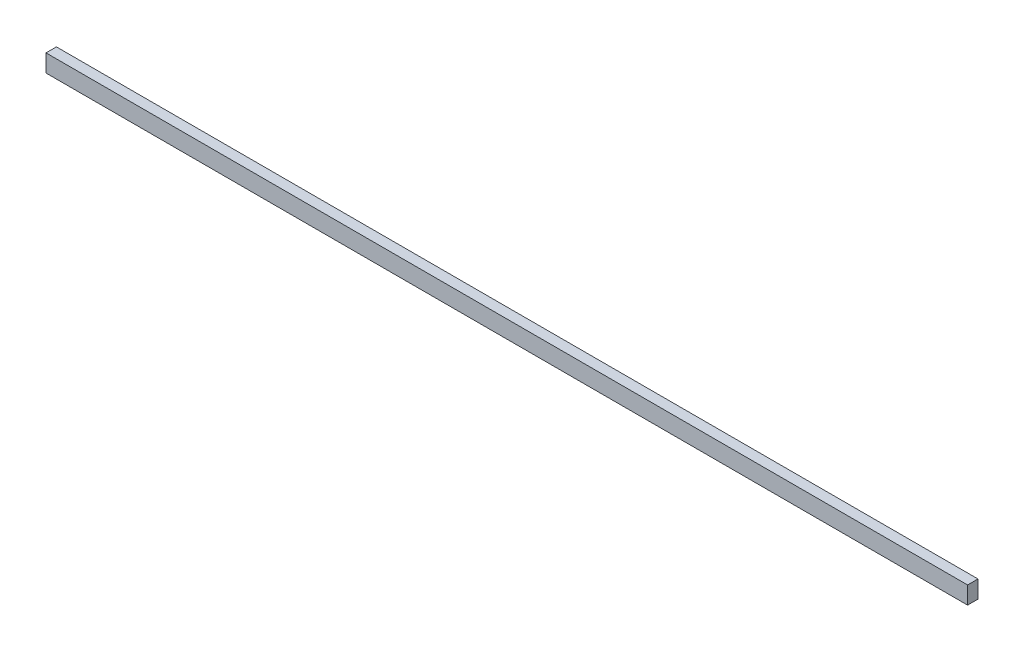
ISO-10303-21;
HEADER;
FILE_DESCRIPTION(('STEP AP214'),'2;1');
FILE_NAME('part.step','',(''),(''),'','','');
FILE_SCHEMA(('AUTOMOTIVE_DESIGN { 1 0 10303 214 1 1 1 1 }'));
ENDSEC;
DATA;
#1=APPLICATION_CONTEXT('core data for automotive mechanical design processes');
#2=APPLICATION_PROTOCOL_DEFINITION('international standard','automotive_design',2000,#1);
#3=PRODUCT_CONTEXT('',#1,'mechanical');
#4=PRODUCT('Part','Part','',(#3));
#5=PRODUCT_RELATED_PRODUCT_CATEGORY('part','',(#4));
#6=PRODUCT_DEFINITION_FORMATION('','',#4);
#7=PRODUCT_DEFINITION_CONTEXT('part definition',#1,'design');
#8=PRODUCT_DEFINITION('design','',#6,#7);
#9=PRODUCT_DEFINITION_SHAPE('','',#8);
#10=(LENGTH_UNIT() NAMED_UNIT(*) SI_UNIT(.MILLI.,.METRE.));
#11=(NAMED_UNIT(*) PLANE_ANGLE_UNIT() SI_UNIT($,.RADIAN.));
#12=(NAMED_UNIT(*) SI_UNIT($,.STERADIAN.) SOLID_ANGLE_UNIT());
#13=UNCERTAINTY_MEASURE_WITH_UNIT(LENGTH_MEASURE(1.E-05),#10,'distance_accuracy_value','');
#14=(GEOMETRIC_REPRESENTATION_CONTEXT(3) GLOBAL_UNCERTAINTY_ASSIGNED_CONTEXT((#13)) GLOBAL_UNIT_ASSIGNED_CONTEXT((#10,
#11,#12)) REPRESENTATION_CONTEXT('',''));
#15=CARTESIAN_POINT('',(0.,0.,0.));
#16=DIRECTION('',(0.,0.,1.));
#17=DIRECTION('',(1.,0.,0.));
#18=AXIS2_PLACEMENT_3D('',#15,#16,#17);
#19=CARTESIAN_POINT('',(0.,0.,22.));
#20=DIRECTION('',(1.,0.,0.));
#21=DIRECTION('',(0.,0.,-1.));
#22=AXIS2_PLACEMENT_3D('',#19,#20,#21);
#23=PLANE('',#22);
#24=DIRECTION('',(0.,-1.,0.));
#25=VECTOR('',#24,1.);
#26=CARTESIAN_POINT('',(0.,0.,0.));
#27=LINE('',#26,#25);
#28=CARTESIAN_POINT('',(0.,37.,0.));
#29=VERTEX_POINT('',#28);
#30=CARTESIAN_POINT('',(0.,0.,0.));
#31=VERTEX_POINT('',#30);
#32=EDGE_CURVE('E96',#29,#31,#27,.T.);
#33=ORIENTED_EDGE('',*,*,#32,.T.);
#34=DIRECTION('',(0.,0.,-1.));
#35=VECTOR('',#34,1.);
#36=CARTESIAN_POINT('',(0.,0.,22.));
#37=LINE('',#36,#35);
#38=CARTESIAN_POINT('',(0.,0.,22.));
#39=VERTEX_POINT('',#38);
#40=EDGE_CURVE('E11',#39,#31,#37,.T.);
#41=ORIENTED_EDGE('',*,*,#40,.F.);
#42=DIRECTION('',(0.,-1.,0.));
#43=VECTOR('',#42,1.);
#44=CARTESIAN_POINT('',(0.,0.,22.));
#45=LINE('',#44,#43);
#46=CARTESIAN_POINT('',(0.,37.,22.));
#47=VERTEX_POINT('',#46);
#48=EDGE_CURVE('E84',#47,#39,#45,.T.);
#49=ORIENTED_EDGE('',*,*,#48,.F.);
#50=DIRECTION('',(0.,0.,-1.));
#51=VECTOR('',#50,1.);
#52=CARTESIAN_POINT('',(0.,37.,22.));
#53=LINE('',#52,#51);
#54=EDGE_CURVE('E92',#47,#29,#53,.T.);
#55=ORIENTED_EDGE('',*,*,#54,.T.);
#56=EDGE_LOOP('',(#33,#41,#49,#55));
#57=FACE_BOUND('',#56,.T.);
#58=ADVANCED_FACE('F33',(#57),#23,.F.);
#59=CARTESIAN_POINT('',(0.,0.,22.));
#60=DIRECTION('',(0.,1.,0.));
#61=DIRECTION('',(0.,0.,1.));
#62=AXIS2_PLACEMENT_3D('',#59,#60,#61);
#63=PLANE('',#62);
#64=DIRECTION('',(1.,0.,0.));
#65=VECTOR('',#64,1.);
#66=CARTESIAN_POINT('',(0.,0.,0.));
#67=LINE('',#66,#65);
#68=CARTESIAN_POINT('',(1950.,0.,0.));
#69=VERTEX_POINT('',#68);
#70=EDGE_CURVE('E88',#31,#69,#67,.T.);
#71=ORIENTED_EDGE('',*,*,#70,.T.);
#72=DIRECTION('',(0.,0.,-1.));
#73=VECTOR('',#72,1.);
#74=CARTESIAN_POINT('',(1950.,0.,22.));
#75=LINE('',#74,#73);
#76=CARTESIAN_POINT('',(1950.,0.,22.));
#77=VERTEX_POINT('',#76);
#78=EDGE_CURVE('E41',#77,#69,#75,.T.);
#79=ORIENTED_EDGE('',*,*,#78,.F.);
#80=DIRECTION('',(1.,0.,0.));
#81=VECTOR('',#80,1.);
#82=CARTESIAN_POINT('',(0.,0.,22.));
#83=LINE('',#82,#81);
#84=EDGE_CURVE('E79',#39,#77,#83,.T.);
#85=ORIENTED_EDGE('',*,*,#84,.F.);
#86=ORIENTED_EDGE('',*,*,#40,.T.);
#87=EDGE_LOOP('',(#71,#79,#85,#86));
#88=FACE_BOUND('',#87,.T.);
#89=ADVANCED_FACE('F87',(#88),#63,.F.);
#90=CARTESIAN_POINT('',(1950.,0.,22.));
#91=DIRECTION('',(-1.,0.,0.));
#92=DIRECTION('',(0.,0.,1.));
#93=AXIS2_PLACEMENT_3D('',#90,#91,#92);
#94=PLANE('',#93);
#95=DIRECTION('',(0.,1.,0.));
#96=VECTOR('',#95,1.);
#97=CARTESIAN_POINT('',(1950.,0.,0.));
#98=LINE('',#97,#96);
#99=CARTESIAN_POINT('',(1950.,37.,0.));
#100=VERTEX_POINT('',#99);
#101=EDGE_CURVE('E66',#69,#100,#98,.T.);
#102=ORIENTED_EDGE('',*,*,#101,.T.);
#103=DIRECTION('',(0.,0.,-1.));
#104=VECTOR('',#103,1.);
#105=CARTESIAN_POINT('',(1950.,37.,22.));
#106=LINE('',#105,#104);
#107=CARTESIAN_POINT('',(1950.,37.,22.));
#108=VERTEX_POINT('',#107);
#109=EDGE_CURVE('E89',#108,#100,#106,.T.);
#110=ORIENTED_EDGE('',*,*,#109,.F.);
#111=DIRECTION('',(0.,1.,0.));
#112=VECTOR('',#111,1.);
#113=CARTESIAN_POINT('',(1950.,0.,22.));
#114=LINE('',#113,#112);
#115=EDGE_CURVE('E82',#77,#108,#114,.T.);
#116=ORIENTED_EDGE('',*,*,#115,.F.);
#117=ORIENTED_EDGE('',*,*,#78,.T.);
#118=EDGE_LOOP('',(#102,#110,#116,#117));
#119=FACE_BOUND('',#118,.T.);
#120=ADVANCED_FACE('F90',(#119),#94,.F.);
#121=CARTESIAN_POINT('',(0.,37.,22.));
#122=DIRECTION('',(0.,-1.,0.));
#123=DIRECTION('',(0.,0.,-1.));
#124=AXIS2_PLACEMENT_3D('',#121,#122,#123);
#125=PLANE('',#124);
#126=DIRECTION('',(-1.,0.,0.));
#127=VECTOR('',#126,1.);
#128=CARTESIAN_POINT('',(0.,37.,0.));
#129=LINE('',#128,#127);
#130=EDGE_CURVE('E72',#100,#29,#129,.T.);
#131=ORIENTED_EDGE('',*,*,#130,.T.);
#132=ORIENTED_EDGE('',*,*,#54,.F.);
#133=DIRECTION('',(-1.,0.,0.));
#134=VECTOR('',#133,1.);
#135=CARTESIAN_POINT('',(0.,37.,22.));
#136=LINE('',#135,#134);
#137=EDGE_CURVE('E49',#108,#47,#136,.T.);
#138=ORIENTED_EDGE('',*,*,#137,.F.);
#139=ORIENTED_EDGE('',*,*,#109,.T.);
#140=EDGE_LOOP('',(#131,#132,#138,#139));
#141=FACE_BOUND('',#140,.T.);
#142=ADVANCED_FACE('F103',(#141),#125,.F.);
#143=CARTESIAN_POINT('',(0.,0.,22.));
#144=DIRECTION('',(0.,0.,-1.));
#145=DIRECTION('',(-1.,0.,0.));
#146=AXIS2_PLACEMENT_3D('',#143,#144,#145);
#147=PLANE('',#146);
#148=ORIENTED_EDGE('',*,*,#48,.T.);
#149=ORIENTED_EDGE('',*,*,#84,.T.);
#150=ORIENTED_EDGE('',*,*,#115,.T.);
#151=ORIENTED_EDGE('',*,*,#137,.T.);
#152=EDGE_LOOP('',(#148,#149,#150,#151));
#153=FACE_BOUND('',#152,.T.);
#154=ADVANCED_FACE('F80',(#153),#147,.F.);
#155=CARTESIAN_POINT('',(0.,0.,0.));
#156=DIRECTION('',(0.,0.,-1.));
#157=DIRECTION('',(-1.,0.,0.));
#158=AXIS2_PLACEMENT_3D('',#155,#156,#157);
#159=PLANE('',#158);
#160=ORIENTED_EDGE('',*,*,#32,.F.);
#161=ORIENTED_EDGE('',*,*,#130,.F.);
#162=ORIENTED_EDGE('',*,*,#101,.F.);
#163=ORIENTED_EDGE('',*,*,#70,.F.);
#164=EDGE_LOOP('',(#160,#161,#162,#163));
#165=FACE_BOUND('',#164,.T.);
#166=ADVANCED_FACE('F106',(#165),#159,.T.);
#167=CLOSED_SHELL('',(#58,#89,#120,#142,#154,#166));
#168=MANIFOLD_SOLID_BREP('B2',#167);
#169=ADVANCED_BREP_SHAPE_REPRESENTATION('',(#18,#168),#14);
#170=SHAPE_DEFINITION_REPRESENTATION(#9,#169);
ENDSEC;
END-ISO-10303-21;
